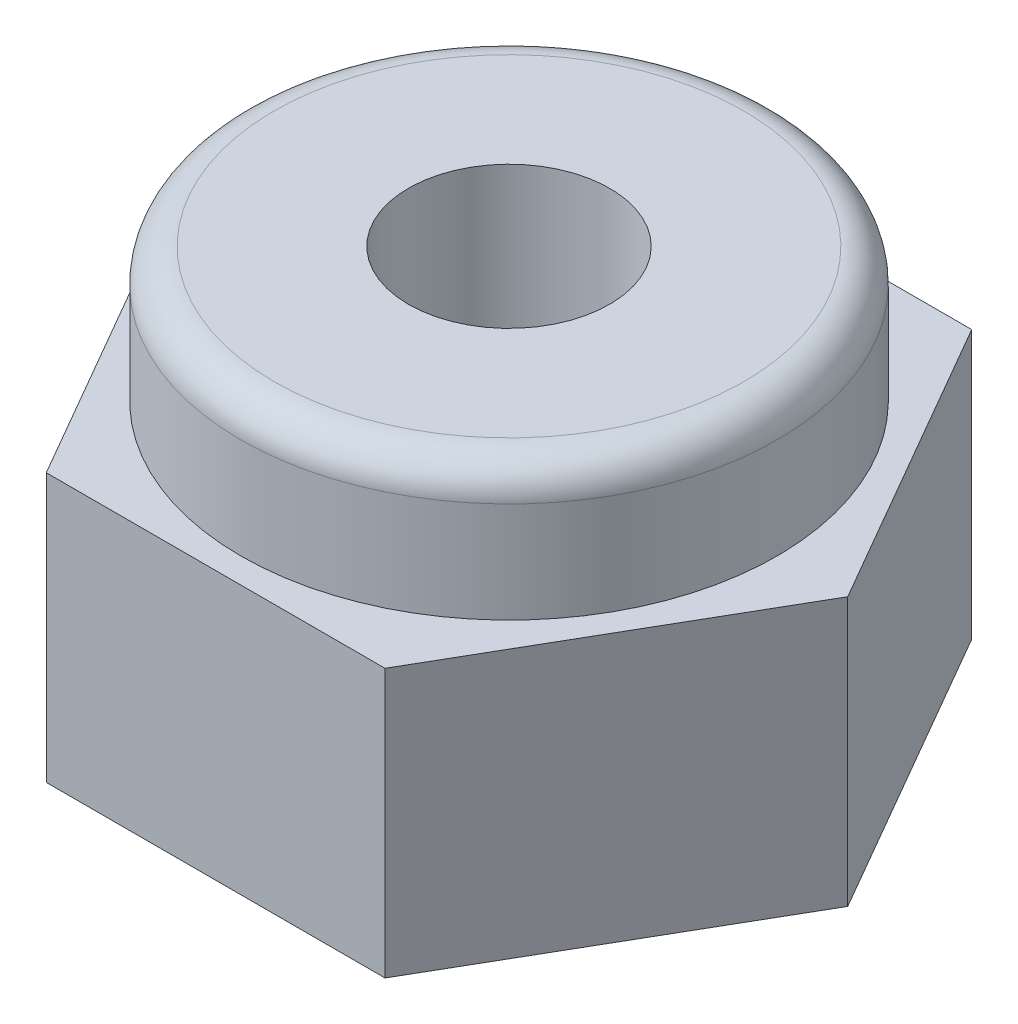
ISO-10303-21;
HEADER;
FILE_DESCRIPTION(('STEP AP214'),'2;1');
FILE_NAME('part.step','',(''),(''),'','','');
FILE_SCHEMA(('AUTOMOTIVE_DESIGN { 1 0 10303 214 1 1 1 1 }'));
ENDSEC;
DATA;
#1=APPLICATION_CONTEXT('core data for automotive mechanical design processes');
#2=APPLICATION_PROTOCOL_DEFINITION('international standard','automotive_design',2000,#1);
#3=PRODUCT_CONTEXT('',#1,'mechanical');
#4=PRODUCT('Part','Part','',(#3));
#5=PRODUCT_RELATED_PRODUCT_CATEGORY('part','',(#4));
#6=PRODUCT_DEFINITION_FORMATION('','',#4);
#7=PRODUCT_DEFINITION_CONTEXT('part definition',#1,'design');
#8=PRODUCT_DEFINITION('design','',#6,#7);
#9=PRODUCT_DEFINITION_SHAPE('','',#8);
#10=(LENGTH_UNIT() NAMED_UNIT(*) SI_UNIT(.MILLI.,.METRE.));
#11=(NAMED_UNIT(*) PLANE_ANGLE_UNIT() SI_UNIT($,.RADIAN.));
#12=(NAMED_UNIT(*) SI_UNIT($,.STERADIAN.) SOLID_ANGLE_UNIT());
#13=UNCERTAINTY_MEASURE_WITH_UNIT(LENGTH_MEASURE(1.E-05),#10,'distance_accuracy_value','');
#14=(GEOMETRIC_REPRESENTATION_CONTEXT(3) GLOBAL_UNCERTAINTY_ASSIGNED_CONTEXT((#13)) GLOBAL_UNIT_ASSIGNED_CONTEXT((#10,
#11,#12)) REPRESENTATION_CONTEXT('',''));
#15=CARTESIAN_POINT('',(0.,0.,0.));
#16=DIRECTION('',(0.,0.,1.));
#17=DIRECTION('',(1.,0.,0.));
#18=AXIS2_PLACEMENT_3D('',#15,#16,#17);
#19=CARTESIAN_POINT('',(0.,4.,0.));
#20=DIRECTION('',(0.,1.,0.));
#21=DIRECTION('',(0.,0.,1.));
#22=AXIS2_PLACEMENT_3D('',#19,#20,#21);
#23=PLANE('',#22);
#24=DIRECTION('',(-0.5,0.,-0.866025403784438));
#25=VECTOR('',#24,1.);
#26=CARTESIAN_POINT('',(5.05181485540923,4.,0.));
#27=LINE('',#26,#25);
#28=CARTESIAN_POINT('',(5.05181485540923,4.,0.));
#29=VERTEX_POINT('',#28);
#30=CARTESIAN_POINT('',(2.52590742770461,4.,-4.375));
#31=VERTEX_POINT('',#30);
#32=EDGE_CURVE('E134',#29,#31,#27,.T.);
#33=ORIENTED_EDGE('',*,*,#32,.T.);
#34=DIRECTION('',(-1.,0.,0.));
#35=VECTOR('',#34,1.);
#36=CARTESIAN_POINT('',(2.52590742770461,4.,-4.375));
#37=LINE('',#36,#35);
#38=CARTESIAN_POINT('',(-2.52590742770461,4.,-4.375));
#39=VERTEX_POINT('',#38);
#40=EDGE_CURVE('E92',#31,#39,#37,.T.);
#41=ORIENTED_EDGE('',*,*,#40,.T.);
#42=DIRECTION('',(-0.5,0.,0.866025403784439));
#43=VECTOR('',#42,1.);
#44=CARTESIAN_POINT('',(-2.52590742770461,4.,-4.375));
#45=LINE('',#44,#43);
#46=CARTESIAN_POINT('',(-5.05181485540922,4.,0.));
#47=VERTEX_POINT('',#46);
#48=EDGE_CURVE('E105',#39,#47,#45,.T.);
#49=ORIENTED_EDGE('',*,*,#48,.T.);
#50=DIRECTION('',(0.5,0.,0.866025403784438));
#51=VECTOR('',#50,1.);
#52=CARTESIAN_POINT('',(-5.05181485540922,4.,0.));
#53=LINE('',#52,#51);
#54=CARTESIAN_POINT('',(-2.52590742770461,4.,4.375));
#55=VERTEX_POINT('',#54);
#56=EDGE_CURVE('E99',#47,#55,#53,.T.);
#57=ORIENTED_EDGE('',*,*,#56,.T.);
#58=DIRECTION('',(1.,0.,0.));
#59=VECTOR('',#58,1.);
#60=CARTESIAN_POINT('',(-2.52590742770461,4.,4.375));
#61=LINE('',#60,#59);
#62=CARTESIAN_POINT('',(2.52590742770461,4.,4.375));
#63=VERTEX_POINT('',#62);
#64=EDGE_CURVE('E103',#55,#63,#61,.T.);
#65=ORIENTED_EDGE('',*,*,#64,.T.);
#66=DIRECTION('',(0.5,0.,-0.866025403784439));
#67=VECTOR('',#66,1.);
#68=CARTESIAN_POINT('',(2.52590742770461,4.,4.375));
#69=LINE('',#68,#67);
#70=EDGE_CURVE('E54',#63,#29,#69,.T.);
#71=ORIENTED_EDGE('',*,*,#70,.T.);
#72=EDGE_LOOP('',(#33,#41,#49,#57,#65,#71));
#73=FACE_BOUND('',#72,.T.);
#74=CARTESIAN_POINT('',(0.,4.,0.));
#75=DIRECTION('',(0.,1.,0.));
#76=DIRECTION('',(0.,0.,1.));
#77=AXIS2_PLACEMENT_3D('',#74,#75,#76);
#78=CIRCLE('',#77,4.);
#79=CARTESIAN_POINT('',(0.,4.,4.));
#80=VERTEX_POINT('',#79);
#81=EDGE_CURVE('E196',#80,#80,#78,.T.);
#82=ORIENTED_EDGE('',*,*,#81,.F.);
#83=EDGE_LOOP('',(#82));
#84=FACE_BOUND('',#83,.T.);
#85=ADVANCED_FACE('F37',(#73,#84),#23,.T.);
#86=CARTESIAN_POINT('',(0.,0.,0.));
#87=DIRECTION('',(0.,1.,0.));
#88=DIRECTION('',(0.,0.,1.));
#89=AXIS2_PLACEMENT_3D('',#86,#87,#88);
#90=PLANE('',#89);
#91=DIRECTION('',(-0.5,0.,-0.866025403784438));
#92=VECTOR('',#91,1.);
#93=CARTESIAN_POINT('',(5.05181485540923,0.,0.));
#94=LINE('',#93,#92);
#95=CARTESIAN_POINT('',(5.05181485540923,0.,0.));
#96=VERTEX_POINT('',#95);
#97=CARTESIAN_POINT('',(2.52590742770461,0.,-4.375));
#98=VERTEX_POINT('',#97);
#99=EDGE_CURVE('E123',#96,#98,#94,.T.);
#100=ORIENTED_EDGE('',*,*,#99,.F.);
#101=DIRECTION('',(0.5,0.,-0.866025403784439));
#102=VECTOR('',#101,1.);
#103=CARTESIAN_POINT('',(2.52590742770461,0.,4.375));
#104=LINE('',#103,#102);
#105=CARTESIAN_POINT('',(2.52590742770461,0.,4.375));
#106=VERTEX_POINT('',#105);
#107=EDGE_CURVE('E83',#106,#96,#104,.T.);
#108=ORIENTED_EDGE('',*,*,#107,.F.);
#109=DIRECTION('',(1.,0.,0.));
#110=VECTOR('',#109,1.);
#111=CARTESIAN_POINT('',(-2.52590742770461,0.,4.375));
#112=LINE('',#111,#110);
#113=CARTESIAN_POINT('',(-2.52590742770461,0.,4.375));
#114=VERTEX_POINT('',#113);
#115=EDGE_CURVE('E77',#114,#106,#112,.T.);
#116=ORIENTED_EDGE('',*,*,#115,.F.);
#117=DIRECTION('',(0.5,0.,0.866025403784438));
#118=VECTOR('',#117,1.);
#119=CARTESIAN_POINT('',(-5.05181485540922,0.,0.));
#120=LINE('',#119,#118);
#121=CARTESIAN_POINT('',(-5.05181485540922,0.,0.));
#122=VERTEX_POINT('',#121);
#123=EDGE_CURVE('E113',#122,#114,#120,.T.);
#124=ORIENTED_EDGE('',*,*,#123,.F.);
#125=DIRECTION('',(-0.5,0.,0.866025403784439));
#126=VECTOR('',#125,1.);
#127=CARTESIAN_POINT('',(-2.52590742770461,0.,-4.375));
#128=LINE('',#127,#126);
#129=CARTESIAN_POINT('',(-2.52590742770461,0.,-4.375));
#130=VERTEX_POINT('',#129);
#131=EDGE_CURVE('E129',#130,#122,#128,.T.);
#132=ORIENTED_EDGE('',*,*,#131,.F.);
#133=DIRECTION('',(-1.,0.,0.));
#134=VECTOR('',#133,1.);
#135=CARTESIAN_POINT('',(2.52590742770461,0.,-4.375));
#136=LINE('',#135,#134);
#137=EDGE_CURVE('E126',#98,#130,#136,.T.);
#138=ORIENTED_EDGE('',*,*,#137,.F.);
#139=EDGE_LOOP('',(#100,#108,#116,#124,#132,#138));
#140=FACE_BOUND('',#139,.T.);
#141=CARTESIAN_POINT('',(0.,0.,0.));
#142=DIRECTION('',(0.,1.,0.));
#143=DIRECTION('',(0.,0.,1.));
#144=AXIS2_PLACEMENT_3D('',#141,#142,#143);
#145=CIRCLE('',#144,1.5);
#146=CARTESIAN_POINT('',(0.,0.,1.5));
#147=VERTEX_POINT('',#146);
#148=EDGE_CURVE('E127',#147,#147,#145,.T.);
#149=ORIENTED_EDGE('',*,*,#148,.T.);
#150=EDGE_LOOP('',(#149));
#151=FACE_BOUND('',#150,.T.);
#152=ADVANCED_FACE('F158',(#140,#151),#90,.F.);
#153=CARTESIAN_POINT('',(5.05181485540923,4.,0.));
#154=DIRECTION('',(-0.866025403784438,0.,0.5));
#155=DIRECTION('',(0.5,0.,0.866025403784439));
#156=AXIS2_PLACEMENT_3D('',#153,#154,#155);
#157=PLANE('',#156);
#158=ORIENTED_EDGE('',*,*,#99,.T.);
#159=DIRECTION('',(0.,-1.,0.));
#160=VECTOR('',#159,1.);
#161=CARTESIAN_POINT('',(2.52590742770461,4.,-4.375));
#162=LINE('',#161,#160);
#163=EDGE_CURVE('E141',#31,#98,#162,.T.);
#164=ORIENTED_EDGE('',*,*,#163,.F.);
#165=ORIENTED_EDGE('',*,*,#32,.F.);
#166=DIRECTION('',(0.,-1.,0.));
#167=VECTOR('',#166,1.);
#168=CARTESIAN_POINT('',(5.05181485540923,4.,0.));
#169=LINE('',#168,#167);
#170=EDGE_CURVE('E119',#29,#96,#169,.T.);
#171=ORIENTED_EDGE('',*,*,#170,.T.);
#172=EDGE_LOOP('',(#158,#164,#165,#171));
#173=FACE_BOUND('',#172,.T.);
#174=ADVANCED_FACE('F163',(#173),#157,.F.);
#175=CARTESIAN_POINT('',(2.52590742770461,4.,-4.375));
#176=DIRECTION('',(0.,0.,1.));
#177=DIRECTION('',(1.,0.,0.));
#178=AXIS2_PLACEMENT_3D('',#175,#176,#177);
#179=PLANE('',#178);
#180=ORIENTED_EDGE('',*,*,#137,.T.);
#181=DIRECTION('',(0.,-1.,0.));
#182=VECTOR('',#181,1.);
#183=CARTESIAN_POINT('',(-2.52590742770461,4.,-4.375));
#184=LINE('',#183,#182);
#185=EDGE_CURVE('E138',#39,#130,#184,.T.);
#186=ORIENTED_EDGE('',*,*,#185,.F.);
#187=ORIENTED_EDGE('',*,*,#40,.F.);
#188=ORIENTED_EDGE('',*,*,#163,.T.);
#189=EDGE_LOOP('',(#180,#186,#187,#188));
#190=FACE_BOUND('',#189,.T.);
#191=ADVANCED_FACE('F179',(#190),#179,.F.);
#192=CARTESIAN_POINT('',(-2.52590742770461,4.,-4.375));
#193=DIRECTION('',(0.866025403784439,0.,0.5));
#194=DIRECTION('',(0.5,0.,-0.866025403784439));
#195=AXIS2_PLACEMENT_3D('',#192,#193,#194);
#196=PLANE('',#195);
#197=ORIENTED_EDGE('',*,*,#131,.T.);
#198=DIRECTION('',(0.,-1.,0.));
#199=VECTOR('',#198,1.);
#200=CARTESIAN_POINT('',(-5.05181485540922,4.,0.));
#201=LINE('',#200,#199);
#202=EDGE_CURVE('E114',#47,#122,#201,.T.);
#203=ORIENTED_EDGE('',*,*,#202,.F.);
#204=ORIENTED_EDGE('',*,*,#48,.F.);
#205=ORIENTED_EDGE('',*,*,#185,.T.);
#206=EDGE_LOOP('',(#197,#203,#204,#205));
#207=FACE_BOUND('',#206,.T.);
#208=ADVANCED_FACE('F176',(#207),#196,.F.);
#209=CARTESIAN_POINT('',(-5.05181485540922,4.,0.));
#210=DIRECTION('',(0.866025403784438,0.,-0.5));
#211=DIRECTION('',(-0.5,0.,-0.866025403784438));
#212=AXIS2_PLACEMENT_3D('',#209,#210,#211);
#213=PLANE('',#212);
#214=ORIENTED_EDGE('',*,*,#123,.T.);
#215=DIRECTION('',(0.,-1.,0.));
#216=VECTOR('',#215,1.);
#217=CARTESIAN_POINT('',(-2.52590742770461,4.,4.375));
#218=LINE('',#217,#216);
#219=EDGE_CURVE('E110',#55,#114,#218,.T.);
#220=ORIENTED_EDGE('',*,*,#219,.F.);
#221=ORIENTED_EDGE('',*,*,#56,.F.);
#222=ORIENTED_EDGE('',*,*,#202,.T.);
#223=EDGE_LOOP('',(#214,#220,#221,#222));
#224=FACE_BOUND('',#223,.T.);
#225=ADVANCED_FACE('F111',(#224),#213,.F.);
#226=CARTESIAN_POINT('',(-2.52590742770461,4.,4.375));
#227=DIRECTION('',(0.,0.,-1.));
#228=DIRECTION('',(-1.,0.,0.));
#229=AXIS2_PLACEMENT_3D('',#226,#227,#228);
#230=PLANE('',#229);
#231=ORIENTED_EDGE('',*,*,#115,.T.);
#232=DIRECTION('',(0.,-1.,0.));
#233=VECTOR('',#232,1.);
#234=CARTESIAN_POINT('',(2.52590742770461,4.,4.375));
#235=LINE('',#234,#233);
#236=EDGE_CURVE('E115',#63,#106,#235,.T.);
#237=ORIENTED_EDGE('',*,*,#236,.F.);
#238=ORIENTED_EDGE('',*,*,#64,.F.);
#239=ORIENTED_EDGE('',*,*,#219,.T.);
#240=EDGE_LOOP('',(#231,#237,#238,#239));
#241=FACE_BOUND('',#240,.T.);
#242=ADVANCED_FACE('F117',(#241),#230,.F.);
#243=CARTESIAN_POINT('',(2.52590742770461,4.,4.375));
#244=DIRECTION('',(-0.866025403784439,0.,-0.5));
#245=DIRECTION('',(-0.5,0.,0.866025403784439));
#246=AXIS2_PLACEMENT_3D('',#243,#244,#245);
#247=PLANE('',#246);
#248=ORIENTED_EDGE('',*,*,#107,.T.);
#249=ORIENTED_EDGE('',*,*,#170,.F.);
#250=ORIENTED_EDGE('',*,*,#70,.F.);
#251=ORIENTED_EDGE('',*,*,#236,.T.);
#252=EDGE_LOOP('',(#248,#249,#250,#251));
#253=FACE_BOUND('',#252,.T.);
#254=ADVANCED_FACE('F169',(#253),#247,.F.);
#255=CARTESIAN_POINT('',(0.,4.,0.));
#256=DIRECTION('',(0.,-1.,0.));
#257=DIRECTION('',(0.,0.,-1.));
#258=AXIS2_PLACEMENT_3D('',#255,#256,#257);
#259=CYLINDRICAL_SURFACE('',#258,1.5);
#260=ORIENTED_EDGE('',*,*,#148,.F.);
#261=EDGE_LOOP('',(#260));
#262=FACE_BOUND('',#261,.T.);
#263=CARTESIAN_POINT('',(0.,6.,0.));
#264=DIRECTION('',(0.,1.,0.));
#265=DIRECTION('',(0.,0.,1.));
#266=AXIS2_PLACEMENT_3D('',#263,#264,#265);
#267=CIRCLE('',#266,1.5);
#268=CARTESIAN_POINT('',(0.,6.,1.5));
#269=VERTEX_POINT('',#268);
#270=EDGE_CURVE('E199',#269,#269,#267,.T.);
#271=ORIENTED_EDGE('',*,*,#270,.T.);
#272=EDGE_LOOP('',(#271));
#273=FACE_BOUND('',#272,.T.);
#274=ADVANCED_FACE('F167',(#262,#273),#259,.F.);
#275=CARTESIAN_POINT('',(0.,6.,0.));
#276=DIRECTION('',(0.,1.,0.));
#277=DIRECTION('',(0.,0.,1.));
#278=AXIS2_PLACEMENT_3D('',#275,#276,#277);
#279=PLANE('',#278);
#280=CARTESIAN_POINT('',(0.,6.,0.));
#281=DIRECTION('',(0.,1.,0.));
#282=DIRECTION('',(0.,0.,1.));
#283=AXIS2_PLACEMENT_3D('',#280,#281,#282);
#284=CIRCLE('',#283,3.5);
#285=CARTESIAN_POINT('',(0.,6.,3.5));
#286=VERTEX_POINT('',#285);
#287=EDGE_CURVE('E46',#286,#286,#284,.T.);
#288=ORIENTED_EDGE('',*,*,#287,.T.);
#289=EDGE_LOOP('',(#288));
#290=FACE_BOUND('',#289,.T.);
#291=ORIENTED_EDGE('',*,*,#270,.F.);
#292=EDGE_LOOP('',(#291));
#293=FACE_BOUND('',#292,.T.);
#294=ADVANCED_FACE('F145',(#290,#293),#279,.T.);
#295=CARTESIAN_POINT('',(0.,6.,0.));
#296=DIRECTION('',(0.,-1.,0.));
#297=DIRECTION('',(0.,0.,-1.));
#298=AXIS2_PLACEMENT_3D('',#295,#296,#297);
#299=CYLINDRICAL_SURFACE('',#298,4.);
#300=CARTESIAN_POINT('',(0.,5.5,0.));
#301=DIRECTION('',(0.,1.,0.));
#302=DIRECTION('',(0.,0.,1.));
#303=AXIS2_PLACEMENT_3D('',#300,#301,#302);
#304=CIRCLE('',#303,4.);
#305=CARTESIAN_POINT('',(0.,5.5,4.));
#306=VERTEX_POINT('',#305);
#307=EDGE_CURVE('E11',#306,#306,#304,.F.);
#308=ORIENTED_EDGE('',*,*,#307,.T.);
#309=EDGE_LOOP('',(#308));
#310=FACE_BOUND('',#309,.T.);
#311=ORIENTED_EDGE('',*,*,#81,.T.);
#312=EDGE_LOOP('',(#311));
#313=FACE_BOUND('',#312,.T.);
#314=ADVANCED_FACE('F149',(#310,#313),#299,.T.);
#315=CARTESIAN_POINT('',(0.,5.5,0.));
#316=DIRECTION('',(0.,1.,0.));
#317=DIRECTION('',(0.,0.,1.));
#318=AXIS2_PLACEMENT_3D('',#315,#316,#317);
#319=TOROIDAL_SURFACE('',#318,3.5,0.5);
#320=ORIENTED_EDGE('',*,*,#307,.F.);
#321=EDGE_LOOP('',(#320));
#322=FACE_BOUND('',#321,.T.);
#323=ORIENTED_EDGE('',*,*,#287,.F.);
#324=EDGE_LOOP('',(#323));
#325=FACE_BOUND('',#324,.T.);
#326=ADVANCED_FACE('F39',(#322,#325),#319,.T.);
#327=CLOSED_SHELL('',(#85,#152,#174,#191,#208,#225,#242,#254,#274,#294,#314,#326));
#328=MANIFOLD_SOLID_BREP('B2',#327);
#329=ADVANCED_BREP_SHAPE_REPRESENTATION('',(#18,#328),#14);
#330=SHAPE_DEFINITION_REPRESENTATION(#9,#329);
ENDSEC;
END-ISO-10303-21;
